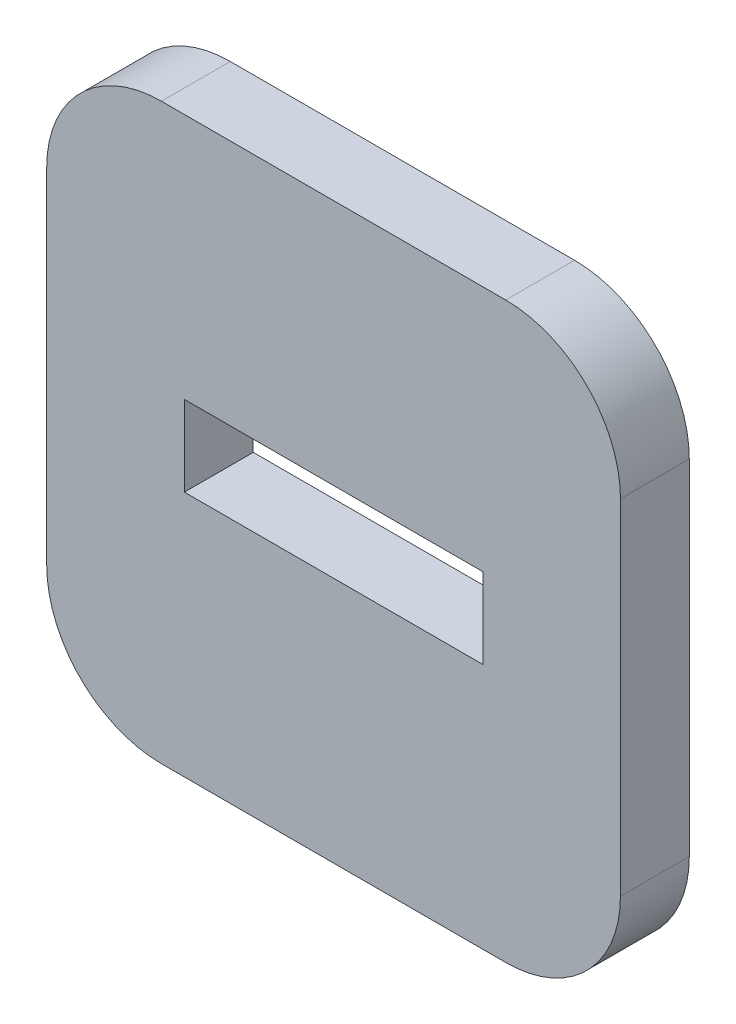
ISO-10303-21;
HEADER;
FILE_DESCRIPTION(('STEP AP214'),'2;1');
FILE_NAME('part.step','',(''),(''),'','','');
FILE_SCHEMA(('AUTOMOTIVE_DESIGN { 1 0 10303 214 1 1 1 1 }'));
ENDSEC;
DATA;
#1=APPLICATION_CONTEXT('core data for automotive mechanical design processes');
#2=APPLICATION_PROTOCOL_DEFINITION('international standard','automotive_design',2000,#1);
#3=PRODUCT_CONTEXT('',#1,'mechanical');
#4=PRODUCT('Part','Part','',(#3));
#5=PRODUCT_RELATED_PRODUCT_CATEGORY('part','',(#4));
#6=PRODUCT_DEFINITION_FORMATION('','',#4);
#7=PRODUCT_DEFINITION_CONTEXT('part definition',#1,'design');
#8=PRODUCT_DEFINITION('design','',#6,#7);
#9=PRODUCT_DEFINITION_SHAPE('','',#8);
#10=(LENGTH_UNIT() NAMED_UNIT(*) SI_UNIT(.MILLI.,.METRE.));
#11=(NAMED_UNIT(*) PLANE_ANGLE_UNIT() SI_UNIT($,.RADIAN.));
#12=(NAMED_UNIT(*) SI_UNIT($,.STERADIAN.) SOLID_ANGLE_UNIT());
#13=UNCERTAINTY_MEASURE_WITH_UNIT(LENGTH_MEASURE(1.E-05),#10,'distance_accuracy_value','');
#14=(GEOMETRIC_REPRESENTATION_CONTEXT(3) GLOBAL_UNCERTAINTY_ASSIGNED_CONTEXT((#13)) GLOBAL_UNIT_ASSIGNED_CONTEXT((#10,
#11,#12)) REPRESENTATION_CONTEXT('',''));
#15=CARTESIAN_POINT('',(0.,0.,0.));
#16=DIRECTION('',(0.,0.,1.));
#17=DIRECTION('',(1.,0.,0.));
#18=AXIS2_PLACEMENT_3D('',#15,#16,#17);
#19=CARTESIAN_POINT('',(-131.108892294877,-12.7,0.));
#20=DIRECTION('',(0.,1.,0.));
#21=DIRECTION('',(1.,0.,0.));
#22=AXIS2_PLACEMENT_3D('',#19,#20,#21);
#23=PLANE('',#22);
#24=DIRECTION('',(0.,0.,1.));
#25=VECTOR('',#24,1.);
#26=CARTESIAN_POINT('',(-126.028892294877,-12.7,0.));
#27=LINE('',#26,#25);
#28=CARTESIAN_POINT('',(-126.028892294877,-12.7,-3.048));
#29=VERTEX_POINT('',#28);
#30=CARTESIAN_POINT('',(-126.028892294877,-12.7,0.));
#31=VERTEX_POINT('',#30);
#32=EDGE_CURVE('E12',#29,#31,#27,.T.);
#33=ORIENTED_EDGE('',*,*,#32,.F.);
#34=DIRECTION('',(-1.,0.,0.));
#35=VECTOR('',#34,1.);
#36=CARTESIAN_POINT('',(0.,-12.7,-3.048));
#37=LINE('',#36,#35);
#38=CARTESIAN_POINT('',(-110.788892294877,-12.7,-3.048));
#39=VERTEX_POINT('',#38);
#40=EDGE_CURVE('E153',#29,#39,#37,.F.);
#41=ORIENTED_EDGE('',*,*,#40,.T.);
#42=DIRECTION('',(0.,0.,1.));
#43=VECTOR('',#42,1.);
#44=CARTESIAN_POINT('',(-110.788892294877,-12.7,0.));
#45=LINE('',#44,#43);
#46=CARTESIAN_POINT('',(-110.788892294877,-12.7,0.));
#47=VERTEX_POINT('',#46);
#48=EDGE_CURVE('E82',#39,#47,#45,.T.);
#49=ORIENTED_EDGE('',*,*,#48,.T.);
#50=DIRECTION('',(1.,0.,0.));
#51=VECTOR('',#50,1.);
#52=CARTESIAN_POINT('',(-131.108892294877,-12.7,0.));
#53=LINE('',#52,#51);
#54=EDGE_CURVE('E230',#31,#47,#53,.T.);
#55=ORIENTED_EDGE('',*,*,#54,.F.);
#56=EDGE_LOOP('',(#33,#41,#49,#55));
#57=FACE_BOUND('',#56,.T.);
#58=ADVANCED_FACE('F71',(#57),#23,.F.);
#59=CARTESIAN_POINT('',(-110.788892294877,-7.62,0.));
#60=DIRECTION('',(0.,0.,-1.));
#61=DIRECTION('',(-1.,0.,0.));
#62=AXIS2_PLACEMENT_3D('',#59,#60,#61);
#63=CYLINDRICAL_SURFACE('',#62,5.08);
#64=ORIENTED_EDGE('',*,*,#48,.F.);
#65=CARTESIAN_POINT('',(-110.788892294877,-7.62,-3.048));
#66=DIRECTION('',(0.,0.,-1.));
#67=DIRECTION('',(-1.,0.,0.));
#68=AXIS2_PLACEMENT_3D('',#65,#66,#67);
#69=CIRCLE('',#68,5.08);
#70=CARTESIAN_POINT('',(-105.708892294877,-7.62,-3.048));
#71=VERTEX_POINT('',#70);
#72=EDGE_CURVE('E185',#39,#71,#69,.F.);
#73=ORIENTED_EDGE('',*,*,#72,.T.);
#74=DIRECTION('',(0.,0.,1.));
#75=VECTOR('',#74,1.);
#76=CARTESIAN_POINT('',(-105.708892294877,-7.62,0.));
#77=LINE('',#76,#75);
#78=CARTESIAN_POINT('',(-105.708892294877,-7.62,0.));
#79=VERTEX_POINT('',#78);
#80=EDGE_CURVE('E220',#71,#79,#77,.T.);
#81=ORIENTED_EDGE('',*,*,#80,.T.);
#82=CARTESIAN_POINT('',(-110.788892294877,-7.62,0.));
#83=DIRECTION('',(0.,0.,-1.));
#84=DIRECTION('',(-1.,0.,0.));
#85=AXIS2_PLACEMENT_3D('',#82,#83,#84);
#86=CIRCLE('',#85,5.08);
#87=EDGE_CURVE('E239',#47,#79,#86,.F.);
#88=ORIENTED_EDGE('',*,*,#87,.F.);
#89=EDGE_LOOP('',(#64,#73,#81,#88));
#90=FACE_BOUND('',#89,.T.);
#91=ADVANCED_FACE('F243',(#90),#63,.T.);
#92=CARTESIAN_POINT('',(-105.708892294877,-12.7,0.));
#93=DIRECTION('',(-1.,0.,0.));
#94=DIRECTION('',(0.,1.,0.));
#95=AXIS2_PLACEMENT_3D('',#92,#93,#94);
#96=PLANE('',#95);
#97=ORIENTED_EDGE('',*,*,#80,.F.);
#98=DIRECTION('',(0.,1.,0.));
#99=VECTOR('',#98,1.);
#100=CARTESIAN_POINT('',(-105.708892294877,0.,-3.048));
#101=LINE('',#100,#99);
#102=CARTESIAN_POINT('',(-105.708892294877,7.61999999999999,-3.048));
#103=VERTEX_POINT('',#102);
#104=EDGE_CURVE('E181',#71,#103,#101,.T.);
#105=ORIENTED_EDGE('',*,*,#104,.T.);
#106=DIRECTION('',(0.,0.,1.));
#107=VECTOR('',#106,1.);
#108=CARTESIAN_POINT('',(-105.708892294877,7.61999999999999,0.));
#109=LINE('',#108,#107);
#110=CARTESIAN_POINT('',(-105.708892294877,7.61999999999999,0.));
#111=VERTEX_POINT('',#110);
#112=EDGE_CURVE('E216',#103,#111,#109,.T.);
#113=ORIENTED_EDGE('',*,*,#112,.T.);
#114=DIRECTION('',(0.,1.,0.));
#115=VECTOR('',#114,1.);
#116=CARTESIAN_POINT('',(-105.708892294877,-12.7,0.));
#117=LINE('',#116,#115);
#118=EDGE_CURVE('E245',#79,#111,#117,.T.);
#119=ORIENTED_EDGE('',*,*,#118,.F.);
#120=EDGE_LOOP('',(#97,#105,#113,#119));
#121=FACE_BOUND('',#120,.T.);
#122=ADVANCED_FACE('F356',(#121),#96,.F.);
#123=CARTESIAN_POINT('',(-110.788892294877,7.61999999999999,0.));
#124=DIRECTION('',(0.,0.,-1.));
#125=DIRECTION('',(-1.,0.,0.));
#126=AXIS2_PLACEMENT_3D('',#123,#124,#125);
#127=CYLINDRICAL_SURFACE('',#126,5.08);
#128=ORIENTED_EDGE('',*,*,#112,.F.);
#129=CARTESIAN_POINT('',(-110.788892294877,7.61999999999999,-3.048));
#130=DIRECTION('',(0.,0.,-1.));
#131=DIRECTION('',(-1.,0.,0.));
#132=AXIS2_PLACEMENT_3D('',#129,#130,#131);
#133=CIRCLE('',#132,5.08);
#134=CARTESIAN_POINT('',(-110.788892294877,12.7,-3.048));
#135=VERTEX_POINT('',#134);
#136=EDGE_CURVE('E177',#103,#135,#133,.F.);
#137=ORIENTED_EDGE('',*,*,#136,.T.);
#138=DIRECTION('',(0.,0.,1.));
#139=VECTOR('',#138,1.);
#140=CARTESIAN_POINT('',(-110.788892294877,12.7,0.));
#141=LINE('',#140,#139);
#142=CARTESIAN_POINT('',(-110.788892294877,12.7,0.));
#143=VERTEX_POINT('',#142);
#144=EDGE_CURVE('E212',#135,#143,#141,.T.);
#145=ORIENTED_EDGE('',*,*,#144,.T.);
#146=CARTESIAN_POINT('',(-110.788892294877,7.61999999999999,0.));
#147=DIRECTION('',(0.,0.,-1.));
#148=DIRECTION('',(-1.,0.,0.));
#149=AXIS2_PLACEMENT_3D('',#146,#147,#148);
#150=CIRCLE('',#149,5.08);
#151=EDGE_CURVE('E249',#111,#143,#150,.F.);
#152=ORIENTED_EDGE('',*,*,#151,.F.);
#153=EDGE_LOOP('',(#128,#137,#145,#152));
#154=FACE_BOUND('',#153,.T.);
#155=ADVANCED_FACE('F300',(#154),#127,.T.);
#156=CARTESIAN_POINT('',(-131.108892294877,12.7,0.));
#157=DIRECTION('',(0.,1.,0.));
#158=DIRECTION('',(1.,0.,0.));
#159=AXIS2_PLACEMENT_3D('',#156,#157,#158);
#160=PLANE('',#159);
#161=ORIENTED_EDGE('',*,*,#144,.F.);
#162=DIRECTION('',(-1.,0.,0.));
#163=VECTOR('',#162,1.);
#164=CARTESIAN_POINT('',(0.,12.7,-3.048));
#165=LINE('',#164,#163);
#166=CARTESIAN_POINT('',(-126.028892294877,12.7,-3.048));
#167=VERTEX_POINT('',#166);
#168=EDGE_CURVE('E173',#167,#135,#165,.F.);
#169=ORIENTED_EDGE('',*,*,#168,.F.);
#170=DIRECTION('',(0.,0.,1.));
#171=VECTOR('',#170,1.);
#172=CARTESIAN_POINT('',(-126.028892294877,12.7,0.));
#173=LINE('',#172,#171);
#174=CARTESIAN_POINT('',(-126.028892294877,12.7,0.));
#175=VERTEX_POINT('',#174);
#176=EDGE_CURVE('E209',#167,#175,#173,.T.);
#177=ORIENTED_EDGE('',*,*,#176,.T.);
#178=DIRECTION('',(1.,0.,0.));
#179=VECTOR('',#178,1.);
#180=CARTESIAN_POINT('',(-131.108892294877,12.7,0.));
#181=LINE('',#180,#179);
#182=EDGE_CURVE('E256',#175,#143,#181,.T.);
#183=ORIENTED_EDGE('',*,*,#182,.T.);
#184=EDGE_LOOP('',(#161,#169,#177,#183));
#185=FACE_BOUND('',#184,.T.);
#186=ADVANCED_FACE('F305',(#185),#160,.T.);
#187=CARTESIAN_POINT('',(-126.028892294877,7.62,0.));
#188=DIRECTION('',(0.,0.,-1.));
#189=DIRECTION('',(-1.,0.,0.));
#190=AXIS2_PLACEMENT_3D('',#187,#188,#189);
#191=CYLINDRICAL_SURFACE('',#190,5.08);
#192=ORIENTED_EDGE('',*,*,#176,.F.);
#193=CARTESIAN_POINT('',(-126.028892294877,7.62,-3.048));
#194=DIRECTION('',(0.,0.,-1.));
#195=DIRECTION('',(-1.,0.,0.));
#196=AXIS2_PLACEMENT_3D('',#193,#194,#195);
#197=CIRCLE('',#196,5.08);
#198=CARTESIAN_POINT('',(-131.108892294877,7.62,-3.048));
#199=VERTEX_POINT('',#198);
#200=EDGE_CURVE('E169',#167,#199,#197,.F.);
#201=ORIENTED_EDGE('',*,*,#200,.T.);
#202=DIRECTION('',(0.,0.,1.));
#203=VECTOR('',#202,1.);
#204=CARTESIAN_POINT('',(-131.108892294877,7.62,0.));
#205=LINE('',#204,#203);
#206=CARTESIAN_POINT('',(-131.108892294877,7.62,0.));
#207=VERTEX_POINT('',#206);
#208=EDGE_CURVE('E90',#199,#207,#205,.T.);
#209=ORIENTED_EDGE('',*,*,#208,.T.);
#210=CARTESIAN_POINT('',(-126.028892294877,7.62,0.));
#211=DIRECTION('',(0.,0.,-1.));
#212=DIRECTION('',(-1.,0.,0.));
#213=AXIS2_PLACEMENT_3D('',#210,#211,#212);
#214=CIRCLE('',#213,5.08);
#215=EDGE_CURVE('E206',#175,#207,#214,.F.);
#216=ORIENTED_EDGE('',*,*,#215,.F.);
#217=EDGE_LOOP('',(#192,#201,#209,#216));
#218=FACE_BOUND('',#217,.T.);
#219=ADVANCED_FACE('F306',(#218),#191,.T.);
#220=CARTESIAN_POINT('',(-131.108892294877,-12.7,0.));
#221=DIRECTION('',(-1.,0.,0.));
#222=DIRECTION('',(0.,1.,0.));
#223=AXIS2_PLACEMENT_3D('',#220,#221,#222);
#224=PLANE('',#223);
#225=ORIENTED_EDGE('',*,*,#208,.F.);
#226=DIRECTION('',(0.,1.,0.));
#227=VECTOR('',#226,1.);
#228=CARTESIAN_POINT('',(-131.108892294877,0.,-3.048));
#229=LINE('',#228,#227);
#230=CARTESIAN_POINT('',(-131.108892294877,-7.62,-3.048));
#231=VERTEX_POINT('',#230);
#232=EDGE_CURVE('E151',#231,#199,#229,.T.);
#233=ORIENTED_EDGE('',*,*,#232,.F.);
#234=DIRECTION('',(0.,0.,1.));
#235=VECTOR('',#234,1.);
#236=CARTESIAN_POINT('',(-131.108892294877,-7.62,0.));
#237=LINE('',#236,#235);
#238=CARTESIAN_POINT('',(-131.108892294877,-7.62,0.));
#239=VERTEX_POINT('',#238);
#240=EDGE_CURVE('E75',#231,#239,#237,.T.);
#241=ORIENTED_EDGE('',*,*,#240,.T.);
#242=DIRECTION('',(0.,1.,0.));
#243=VECTOR('',#242,1.);
#244=CARTESIAN_POINT('',(-131.108892294877,-12.7,0.));
#245=LINE('',#244,#243);
#246=EDGE_CURVE('E307',#239,#207,#245,.T.);
#247=ORIENTED_EDGE('',*,*,#246,.T.);
#248=EDGE_LOOP('',(#225,#233,#241,#247));
#249=FACE_BOUND('',#248,.T.);
#250=ADVANCED_FACE('F156',(#249),#224,.T.);
#251=CARTESIAN_POINT('',(-125.012892294877,-1.778,0.));
#252=DIRECTION('',(0.,1.,0.));
#253=DIRECTION('',(1.,0.,0.));
#254=AXIS2_PLACEMENT_3D('',#251,#252,#253);
#255=PLANE('',#254);
#256=DIRECTION('',(0.,0.,1.));
#257=VECTOR('',#256,1.);
#258=CARTESIAN_POINT('',(-111.804892294877,-1.778,0.));
#259=LINE('',#258,#257);
#260=CARTESIAN_POINT('',(-111.804892294877,-1.778,-3.048));
#261=VERTEX_POINT('',#260);
#262=CARTESIAN_POINT('',(-111.804892294877,-1.778,0.));
#263=VERTEX_POINT('',#262);
#264=EDGE_CURVE('E146',#261,#263,#259,.T.);
#265=ORIENTED_EDGE('',*,*,#264,.F.);
#266=DIRECTION('',(-1.,0.,0.));
#267=VECTOR('',#266,1.);
#268=CARTESIAN_POINT('',(0.,-1.778,-3.048));
#269=LINE('',#268,#267);
#270=CARTESIAN_POINT('',(-125.012892294877,-1.778,-3.048));
#271=VERTEX_POINT('',#270);
#272=EDGE_CURVE('E163',#271,#261,#269,.F.);
#273=ORIENTED_EDGE('',*,*,#272,.F.);
#274=DIRECTION('',(0.,0.,1.));
#275=VECTOR('',#274,1.);
#276=CARTESIAN_POINT('',(-125.012892294877,-1.778,0.));
#277=LINE('',#276,#275);
#278=CARTESIAN_POINT('',(-125.012892294877,-1.778,0.));
#279=VERTEX_POINT('',#278);
#280=EDGE_CURVE('E195',#271,#279,#277,.T.);
#281=ORIENTED_EDGE('',*,*,#280,.T.);
#282=DIRECTION('',(1.,0.,0.));
#283=VECTOR('',#282,1.);
#284=CARTESIAN_POINT('',(-125.012892294877,-1.778,0.));
#285=LINE('',#284,#283);
#286=EDGE_CURVE('E313',#279,#263,#285,.T.);
#287=ORIENTED_EDGE('',*,*,#286,.T.);
#288=EDGE_LOOP('',(#265,#273,#281,#287));
#289=FACE_BOUND('',#288,.T.);
#290=ADVANCED_FACE('F341',(#289),#255,.T.);
#291=CARTESIAN_POINT('',(-125.012892294877,1.778,0.));
#292=DIRECTION('',(1.,0.,0.));
#293=DIRECTION('',(0.,-1.,0.));
#294=AXIS2_PLACEMENT_3D('',#291,#292,#293);
#295=PLANE('',#294);
#296=ORIENTED_EDGE('',*,*,#280,.F.);
#297=DIRECTION('',(0.,1.,0.));
#298=VECTOR('',#297,1.);
#299=CARTESIAN_POINT('',(-125.012892294877,0.,-3.048));
#300=LINE('',#299,#298);
#301=CARTESIAN_POINT('',(-125.012892294877,1.778,-3.048));
#302=VERTEX_POINT('',#301);
#303=EDGE_CURVE('E158',#302,#271,#300,.F.);
#304=ORIENTED_EDGE('',*,*,#303,.F.);
#305=DIRECTION('',(0.,0.,1.));
#306=VECTOR('',#305,1.);
#307=CARTESIAN_POINT('',(-125.012892294877,1.778,0.));
#308=LINE('',#307,#306);
#309=CARTESIAN_POINT('',(-125.012892294877,1.778,0.));
#310=VERTEX_POINT('',#309);
#311=EDGE_CURVE('E191',#302,#310,#308,.T.);
#312=ORIENTED_EDGE('',*,*,#311,.T.);
#313=DIRECTION('',(0.,-1.,0.));
#314=VECTOR('',#313,1.);
#315=CARTESIAN_POINT('',(-125.012892294877,1.778,0.));
#316=LINE('',#315,#314);
#317=EDGE_CURVE('E288',#310,#279,#316,.T.);
#318=ORIENTED_EDGE('',*,*,#317,.T.);
#319=EDGE_LOOP('',(#296,#304,#312,#318));
#320=FACE_BOUND('',#319,.T.);
#321=ADVANCED_FACE('F286',(#320),#295,.T.);
#322=CARTESIAN_POINT('',(-111.804892294877,1.778,0.));
#323=DIRECTION('',(0.,-1.,0.));
#324=DIRECTION('',(-1.,0.,0.));
#325=AXIS2_PLACEMENT_3D('',#322,#323,#324);
#326=PLANE('',#325);
#327=ORIENTED_EDGE('',*,*,#311,.F.);
#328=DIRECTION('',(-1.,0.,0.));
#329=VECTOR('',#328,1.);
#330=CARTESIAN_POINT('',(0.,1.778,-3.048));
#331=LINE('',#330,#329);
#332=CARTESIAN_POINT('',(-111.804892294877,1.778,-3.048));
#333=VERTEX_POINT('',#332);
#334=EDGE_CURVE('E263',#333,#302,#331,.T.);
#335=ORIENTED_EDGE('',*,*,#334,.F.);
#336=DIRECTION('',(0.,0.,1.));
#337=VECTOR('',#336,1.);
#338=CARTESIAN_POINT('',(-111.804892294877,1.778,0.));
#339=LINE('',#338,#337);
#340=CARTESIAN_POINT('',(-111.804892294877,1.778,0.));
#341=VERTEX_POINT('',#340);
#342=EDGE_CURVE('E196',#333,#341,#339,.T.);
#343=ORIENTED_EDGE('',*,*,#342,.T.);
#344=DIRECTION('',(-1.,0.,0.));
#345=VECTOR('',#344,1.);
#346=CARTESIAN_POINT('',(-111.804892294877,1.778,0.));
#347=LINE('',#346,#345);
#348=EDGE_CURVE('E172',#341,#310,#347,.T.);
#349=ORIENTED_EDGE('',*,*,#348,.T.);
#350=EDGE_LOOP('',(#327,#335,#343,#349));
#351=FACE_BOUND('',#350,.T.);
#352=ADVANCED_FACE('F279',(#351),#326,.T.);
#353=CARTESIAN_POINT('',(-111.804892294877,-1.778,0.));
#354=DIRECTION('',(-1.,0.,0.));
#355=DIRECTION('',(0.,1.,0.));
#356=AXIS2_PLACEMENT_3D('',#353,#354,#355);
#357=PLANE('',#356);
#358=DIRECTION('',(0.,1.,0.));
#359=VECTOR('',#358,1.);
#360=CARTESIAN_POINT('',(-111.804892294877,0.,-3.048));
#361=LINE('',#360,#359);
#362=EDGE_CURVE('E167',#261,#333,#361,.T.);
#363=ORIENTED_EDGE('',*,*,#362,.F.);
#364=ORIENTED_EDGE('',*,*,#264,.T.);
#365=DIRECTION('',(0.,1.,0.));
#366=VECTOR('',#365,1.);
#367=CARTESIAN_POINT('',(-111.804892294877,-1.778,0.));
#368=LINE('',#367,#366);
#369=EDGE_CURVE('E319',#263,#341,#368,.T.);
#370=ORIENTED_EDGE('',*,*,#369,.T.);
#371=ORIENTED_EDGE('',*,*,#342,.F.);
#372=EDGE_LOOP('',(#363,#364,#370,#371));
#373=FACE_BOUND('',#372,.T.);
#374=ADVANCED_FACE('F336',(#373),#357,.T.);
#375=CARTESIAN_POINT('',(-126.028892294877,-7.62,0.));
#376=DIRECTION('',(0.,0.,-1.));
#377=DIRECTION('',(-1.,0.,0.));
#378=AXIS2_PLACEMENT_3D('',#375,#376,#377);
#379=CYLINDRICAL_SURFACE('',#378,5.08);
#380=CARTESIAN_POINT('',(-126.028892294877,-7.62,-3.048));
#381=DIRECTION('',(0.,0.,-1.));
#382=DIRECTION('',(-1.,0.,0.));
#383=AXIS2_PLACEMENT_3D('',#380,#381,#382);
#384=CIRCLE('',#383,5.08);
#385=EDGE_CURVE('E138',#231,#29,#384,.F.);
#386=ORIENTED_EDGE('',*,*,#385,.T.);
#387=ORIENTED_EDGE('',*,*,#32,.T.);
#388=CARTESIAN_POINT('',(-126.028892294877,-7.62,0.));
#389=DIRECTION('',(0.,0.,-1.));
#390=DIRECTION('',(-1.,0.,0.));
#391=AXIS2_PLACEMENT_3D('',#388,#389,#390);
#392=CIRCLE('',#391,5.08);
#393=EDGE_CURVE('E141',#239,#31,#392,.F.);
#394=ORIENTED_EDGE('',*,*,#393,.F.);
#395=ORIENTED_EDGE('',*,*,#240,.F.);
#396=EDGE_LOOP('',(#386,#387,#394,#395));
#397=FACE_BOUND('',#396,.T.);
#398=ADVANCED_FACE('F73',(#397),#379,.T.);
#399=CARTESIAN_POINT('',(0.,0.,0.));
#400=DIRECTION('',(0.,0.,-1.));
#401=DIRECTION('',(-1.,0.,0.));
#402=AXIS2_PLACEMENT_3D('',#399,#400,#401);
#403=PLANE('',#402);
#404=ORIENTED_EDGE('',*,*,#348,.F.);
#405=ORIENTED_EDGE('',*,*,#369,.F.);
#406=ORIENTED_EDGE('',*,*,#286,.F.);
#407=ORIENTED_EDGE('',*,*,#317,.F.);
#408=EDGE_LOOP('',(#404,#405,#406,#407));
#409=FACE_BOUND('',#408,.T.);
#410=ORIENTED_EDGE('',*,*,#246,.F.);
#411=ORIENTED_EDGE('',*,*,#393,.T.);
#412=ORIENTED_EDGE('',*,*,#54,.T.);
#413=ORIENTED_EDGE('',*,*,#87,.T.);
#414=ORIENTED_EDGE('',*,*,#118,.T.);
#415=ORIENTED_EDGE('',*,*,#151,.T.);
#416=ORIENTED_EDGE('',*,*,#182,.F.);
#417=ORIENTED_EDGE('',*,*,#215,.T.);
#418=EDGE_LOOP('',(#410,#411,#412,#413,#414,#415,#416,#417));
#419=FACE_BOUND('',#418,.T.);
#420=ADVANCED_FACE('F237',(#409,#419),#403,.F.);
#421=CARTESIAN_POINT('',(0.,0.,-3.048));
#422=DIRECTION('',(0.,0.,-1.));
#423=DIRECTION('',(-1.,0.,0.));
#424=AXIS2_PLACEMENT_3D('',#421,#422,#423);
#425=PLANE('',#424);
#426=ORIENTED_EDGE('',*,*,#334,.T.);
#427=ORIENTED_EDGE('',*,*,#303,.T.);
#428=ORIENTED_EDGE('',*,*,#272,.T.);
#429=ORIENTED_EDGE('',*,*,#362,.T.);
#430=EDGE_LOOP('',(#426,#427,#428,#429));
#431=FACE_BOUND('',#430,.T.);
#432=ORIENTED_EDGE('',*,*,#232,.T.);
#433=ORIENTED_EDGE('',*,*,#200,.F.);
#434=ORIENTED_EDGE('',*,*,#168,.T.);
#435=ORIENTED_EDGE('',*,*,#136,.F.);
#436=ORIENTED_EDGE('',*,*,#104,.F.);
#437=ORIENTED_EDGE('',*,*,#72,.F.);
#438=ORIENTED_EDGE('',*,*,#40,.F.);
#439=ORIENTED_EDGE('',*,*,#385,.F.);
#440=EDGE_LOOP('',(#432,#433,#434,#435,#436,#437,#438,#439));
#441=FACE_BOUND('',#440,.T.);
#442=ADVANCED_FACE('F149',(#431,#441),#425,.T.);
#443=CLOSED_SHELL('',(#58,#91,#122,#155,#186,#219,#250,#290,#321,#352,#374,#398,#420,#442));
#444=MANIFOLD_SOLID_BREP('B2',#443);
#445=ADVANCED_BREP_SHAPE_REPRESENTATION('',(#18,#444),#14);
#446=SHAPE_DEFINITION_REPRESENTATION(#9,#445);
ENDSEC;
END-ISO-10303-21;
